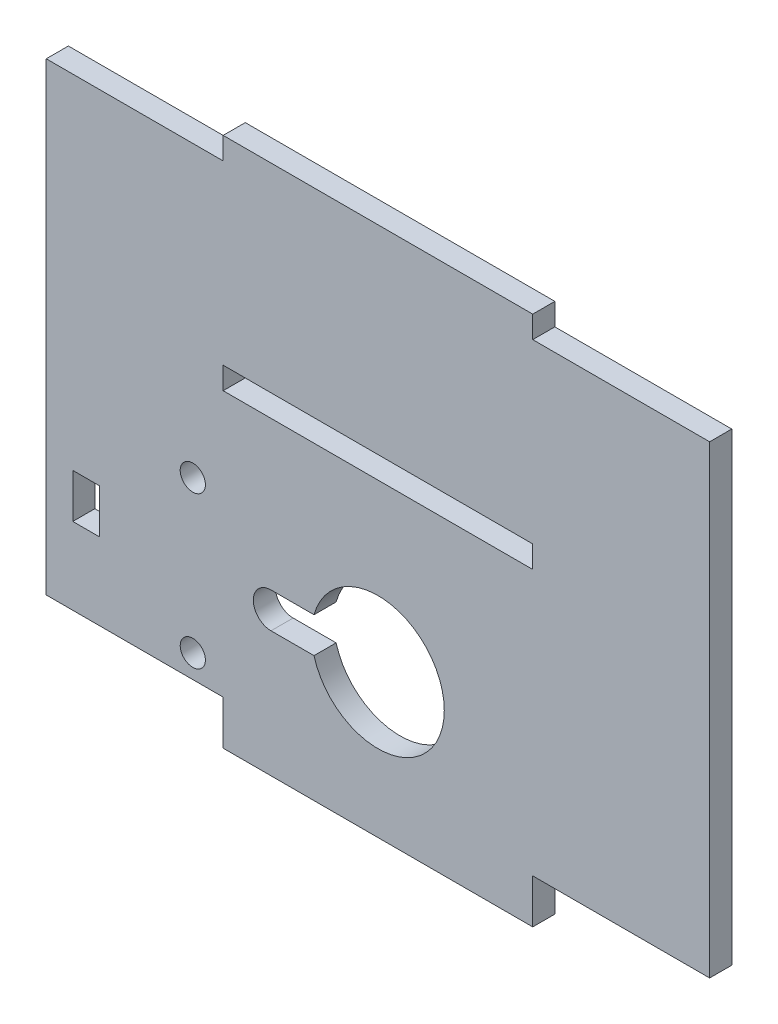
ISO-10303-21;
HEADER;
FILE_DESCRIPTION(('STEP AP214'),'2;1');
FILE_NAME('part.step','',(''),(''),'','','');
FILE_SCHEMA(('AUTOMOTIVE_DESIGN { 1 0 10303 214 1 1 1 1 }'));
ENDSEC;
DATA;
#1=APPLICATION_CONTEXT('core data for automotive mechanical design processes');
#2=APPLICATION_PROTOCOL_DEFINITION('international standard','automotive_design',2000,#1);
#3=PRODUCT_CONTEXT('',#1,'mechanical');
#4=PRODUCT('Part','Part','',(#3));
#5=PRODUCT_RELATED_PRODUCT_CATEGORY('part','',(#4));
#6=PRODUCT_DEFINITION_FORMATION('','',#4);
#7=PRODUCT_DEFINITION_CONTEXT('part definition',#1,'design');
#8=PRODUCT_DEFINITION('design','',#6,#7);
#9=PRODUCT_DEFINITION_SHAPE('','',#8);
#10=(LENGTH_UNIT() NAMED_UNIT(*) SI_UNIT(.MILLI.,.METRE.));
#11=(NAMED_UNIT(*) PLANE_ANGLE_UNIT() SI_UNIT($,.RADIAN.));
#12=(NAMED_UNIT(*) SI_UNIT($,.STERADIAN.) SOLID_ANGLE_UNIT());
#13=UNCERTAINTY_MEASURE_WITH_UNIT(LENGTH_MEASURE(1.E-05),#10,'distance_accuracy_value','');
#14=(GEOMETRIC_REPRESENTATION_CONTEXT(3) GLOBAL_UNCERTAINTY_ASSIGNED_CONTEXT((#13)) GLOBAL_UNIT_ASSIGNED_CONTEXT((#10,
#11,#12)) REPRESENTATION_CONTEXT('',''));
#15=CARTESIAN_POINT('',(0.,0.,0.));
#16=DIRECTION('',(0.,0.,1.));
#17=DIRECTION('',(1.,0.,0.));
#18=AXIS2_PLACEMENT_3D('',#15,#16,#17);
#19=CARTESIAN_POINT('',(0.,0.,2.5));
#20=DIRECTION('',(0.,0.,-1.));
#21=DIRECTION('',(-1.,0.,0.));
#22=AXIS2_PLACEMENT_3D('',#19,#20,#21);
#23=PLANE('',#22);
#24=CARTESIAN_POINT('',(-20.93,-22.38,2.5));
#25=DIRECTION('',(0.,0.,1.));
#26=DIRECTION('',(-1.,0.,0.));
#27=AXIS2_PLACEMENT_3D('',#24,#25,#26);
#28=CIRCLE('',#27,1.425);
#29=CARTESIAN_POINT('',(-22.355,-22.38,2.5));
#30=VERTEX_POINT('',#29);
#31=EDGE_CURVE('E230',#30,#30,#28,.T.);
#32=ORIENTED_EDGE('',*,*,#31,.F.);
#33=EDGE_LOOP('',(#32));
#34=FACE_BOUND('',#33,.T.);
#35=CARTESIAN_POINT('',(-20.93,-5.22000000000001,2.5));
#36=DIRECTION('',(0.,0.,1.));
#37=DIRECTION('',(1.,0.,0.));
#38=AXIS2_PLACEMENT_3D('',#35,#36,#37);
#39=CIRCLE('',#38,1.425);
#40=CARTESIAN_POINT('',(-19.505,-5.22000000000001,2.5));
#41=VERTEX_POINT('',#40);
#42=EDGE_CURVE('E236',#41,#41,#39,.T.);
#43=ORIENTED_EDGE('',*,*,#42,.F.);
#44=EDGE_LOOP('',(#43));
#45=FACE_BOUND('',#44,.T.);
#46=CARTESIAN_POINT('',(0.,-13.8,2.5));
#47=DIRECTION('',(0.,0.,1.));
#48=DIRECTION('',(1.,0.,0.));
#49=AXIS2_PLACEMENT_3D('',#46,#47,#48);
#50=CIRCLE('',#49,7.5);
#51=CARTESIAN_POINT('',(-7.22841614740048,-15.8,2.5));
#52=VERTEX_POINT('',#51);
#53=CARTESIAN_POINT('',(-7.22841614740048,-11.8,2.5));
#54=VERTEX_POINT('',#53);
#55=EDGE_CURVE('E242',#52,#54,#50,.T.);
#56=ORIENTED_EDGE('',*,*,#55,.F.);
#57=DIRECTION('',(1.,0.,0.));
#58=VECTOR('',#57,1.);
#59=CARTESIAN_POINT('',(-12.09,-15.8,2.5));
#60=LINE('',#59,#58);
#61=CARTESIAN_POINT('',(-12.09,-15.8,2.5));
#62=VERTEX_POINT('',#61);
#63=EDGE_CURVE('E250',#62,#52,#60,.T.);
#64=ORIENTED_EDGE('',*,*,#63,.F.);
#65=CARTESIAN_POINT('',(-12.09,-13.8,2.5));
#66=DIRECTION('',(0.,0.,1.));
#67=DIRECTION('',(1.,0.,0.));
#68=AXIS2_PLACEMENT_3D('',#65,#66,#67);
#69=CIRCLE('',#68,2.);
#70=CARTESIAN_POINT('',(-12.09,-11.8,2.5));
#71=VERTEX_POINT('',#70);
#72=EDGE_CURVE('E247',#71,#62,#69,.T.);
#73=ORIENTED_EDGE('',*,*,#72,.F.);
#74=DIRECTION('',(-1.,0.,0.));
#75=VECTOR('',#74,1.);
#76=CARTESIAN_POINT('',(-12.09,-11.8,2.5));
#77=LINE('',#76,#75);
#78=EDGE_CURVE('E244',#54,#71,#77,.T.);
#79=ORIENTED_EDGE('',*,*,#78,.F.);
#80=EDGE_LOOP('',(#56,#64,#73,#79));
#81=FACE_BOUND('',#80,.T.);
#82=DIRECTION('',(0.,-1.,0.));
#83=VECTOR('',#82,1.);
#84=CARTESIAN_POINT('',(-17.5,30.,2.5));
#85=LINE('',#84,#83);
#86=CARTESIAN_POINT('',(-17.5,30.,2.5));
#87=VERTEX_POINT('',#86);
#88=CARTESIAN_POINT('',(-17.5,27.5,2.5));
#89=VERTEX_POINT('',#88);
#90=EDGE_CURVE('E304',#87,#89,#85,.T.);
#91=ORIENTED_EDGE('',*,*,#90,.T.);
#92=DIRECTION('',(-1.,0.,0.));
#93=VECTOR('',#92,1.);
#94=CARTESIAN_POINT('',(-17.5,27.5,2.5));
#95=LINE('',#94,#93);
#96=CARTESIAN_POINT('',(-37.5,27.5,2.5));
#97=VERTEX_POINT('',#96);
#98=EDGE_CURVE('E307',#89,#97,#95,.T.);
#99=ORIENTED_EDGE('',*,*,#98,.T.);
#100=DIRECTION('',(0.,-1.,0.));
#101=VECTOR('',#100,1.);
#102=CARTESIAN_POINT('',(-37.5,27.5,2.5));
#103=LINE('',#102,#101);
#104=CARTESIAN_POINT('',(-37.5,-25.,2.5));
#105=VERTEX_POINT('',#104);
#106=EDGE_CURVE('E310',#97,#105,#103,.T.);
#107=ORIENTED_EDGE('',*,*,#106,.T.);
#108=DIRECTION('',(1.,0.,0.));
#109=VECTOR('',#108,1.);
#110=CARTESIAN_POINT('',(-37.5,-25.,2.5));
#111=LINE('',#110,#109);
#112=CARTESIAN_POINT('',(-17.5,-25.,2.5));
#113=VERTEX_POINT('',#112);
#114=EDGE_CURVE('E312',#105,#113,#111,.T.);
#115=ORIENTED_EDGE('',*,*,#114,.T.);
#116=DIRECTION('',(0.,-1.,0.));
#117=VECTOR('',#116,1.);
#118=CARTESIAN_POINT('',(-17.5,-25.,2.5));
#119=LINE('',#118,#117);
#120=CARTESIAN_POINT('',(-17.5,-30.,2.5));
#121=VERTEX_POINT('',#120);
#122=EDGE_CURVE('E314',#113,#121,#119,.T.);
#123=ORIENTED_EDGE('',*,*,#122,.T.);
#124=DIRECTION('',(1.,0.,0.));
#125=VECTOR('',#124,1.);
#126=CARTESIAN_POINT('',(-17.5,-30.,2.5));
#127=LINE('',#126,#125);
#128=CARTESIAN_POINT('',(17.5,-30.,2.5));
#129=VERTEX_POINT('',#128);
#130=EDGE_CURVE('E316',#121,#129,#127,.T.);
#131=ORIENTED_EDGE('',*,*,#130,.T.);
#132=DIRECTION('',(0.,1.,0.));
#133=VECTOR('',#132,1.);
#134=CARTESIAN_POINT('',(17.5,-25.,2.5));
#135=LINE('',#134,#133);
#136=CARTESIAN_POINT('',(17.5,-25.,2.5));
#137=VERTEX_POINT('',#136);
#138=EDGE_CURVE('E318',#129,#137,#135,.T.);
#139=ORIENTED_EDGE('',*,*,#138,.T.);
#140=DIRECTION('',(1.,0.,0.));
#141=VECTOR('',#140,1.);
#142=CARTESIAN_POINT('',(37.5,-25.,2.5));
#143=LINE('',#142,#141);
#144=CARTESIAN_POINT('',(37.5,-25.,2.5));
#145=VERTEX_POINT('',#144);
#146=EDGE_CURVE('E320',#137,#145,#143,.T.);
#147=ORIENTED_EDGE('',*,*,#146,.T.);
#148=DIRECTION('',(0.,1.,0.));
#149=VECTOR('',#148,1.);
#150=CARTESIAN_POINT('',(37.5,27.5,2.5));
#151=LINE('',#150,#149);
#152=CARTESIAN_POINT('',(37.5,27.5,2.5));
#153=VERTEX_POINT('',#152);
#154=EDGE_CURVE('E322',#145,#153,#151,.T.);
#155=ORIENTED_EDGE('',*,*,#154,.T.);
#156=DIRECTION('',(-1.,0.,0.));
#157=VECTOR('',#156,1.);
#158=CARTESIAN_POINT('',(17.5,27.5,2.5));
#159=LINE('',#158,#157);
#160=CARTESIAN_POINT('',(17.5,27.5,2.5));
#161=VERTEX_POINT('',#160);
#162=EDGE_CURVE('E324',#153,#161,#159,.T.);
#163=ORIENTED_EDGE('',*,*,#162,.T.);
#164=DIRECTION('',(0.,1.,0.));
#165=VECTOR('',#164,1.);
#166=CARTESIAN_POINT('',(17.5,30.,2.5));
#167=LINE('',#166,#165);
#168=CARTESIAN_POINT('',(17.5,30.,2.5));
#169=VERTEX_POINT('',#168);
#170=EDGE_CURVE('E326',#161,#169,#167,.T.);
#171=ORIENTED_EDGE('',*,*,#170,.T.);
#172=DIRECTION('',(-1.,0.,0.));
#173=VECTOR('',#172,1.);
#174=CARTESIAN_POINT('',(17.5,30.,2.5));
#175=LINE('',#174,#173);
#176=EDGE_CURVE('E328',#169,#87,#175,.T.);
#177=ORIENTED_EDGE('',*,*,#176,.T.);
#178=EDGE_LOOP('',(#91,#99,#107,#115,#123,#131,#139,#147,#155,#163,#171,#177));
#179=FACE_BOUND('',#178,.T.);
#180=DIRECTION('',(0.,1.,0.));
#181=VECTOR('',#180,1.);
#182=CARTESIAN_POINT('',(17.5,4.99999999999999,2.5));
#183=LINE('',#182,#181);
#184=CARTESIAN_POINT('',(17.5,4.99999999999999,2.5));
#185=VERTEX_POINT('',#184);
#186=CARTESIAN_POINT('',(17.5,7.49999999999999,2.5));
#187=VERTEX_POINT('',#186);
#188=EDGE_CURVE('E273',#185,#187,#183,.T.);
#189=ORIENTED_EDGE('',*,*,#188,.F.);
#190=DIRECTION('',(1.,0.,0.));
#191=VECTOR('',#190,1.);
#192=CARTESIAN_POINT('',(-17.5,4.99999999999998,2.5));
#193=LINE('',#192,#191);
#194=CARTESIAN_POINT('',(-17.5,4.99999999999998,2.5));
#195=VERTEX_POINT('',#194);
#196=EDGE_CURVE('E281',#195,#185,#193,.T.);
#197=ORIENTED_EDGE('',*,*,#196,.F.);
#198=DIRECTION('',(0.,-1.,0.));
#199=VECTOR('',#198,1.);
#200=CARTESIAN_POINT('',(-17.5,4.99999999999998,2.5));
#201=LINE('',#200,#199);
#202=CARTESIAN_POINT('',(-17.5,7.49999999999999,2.5));
#203=VERTEX_POINT('',#202);
#204=EDGE_CURVE('E278',#203,#195,#201,.T.);
#205=ORIENTED_EDGE('',*,*,#204,.F.);
#206=DIRECTION('',(-1.,0.,0.));
#207=VECTOR('',#206,1.);
#208=CARTESIAN_POINT('',(-17.5,7.49999999999999,2.5));
#209=LINE('',#208,#207);
#210=EDGE_CURVE('E275',#187,#203,#209,.T.);
#211=ORIENTED_EDGE('',*,*,#210,.F.);
#212=EDGE_LOOP('',(#189,#197,#205,#211));
#213=FACE_BOUND('',#212,.T.);
#214=DIRECTION('',(0.,1.,0.));
#215=VECTOR('',#214,1.);
#216=CARTESIAN_POINT('',(-31.5,-16.3,2.5));
#217=LINE('',#216,#215);
#218=CARTESIAN_POINT('',(-31.5,-16.3,2.5));
#219=VERTEX_POINT('',#218);
#220=CARTESIAN_POINT('',(-31.5,-11.3,2.5));
#221=VERTEX_POINT('',#220);
#222=EDGE_CURVE('E194',#219,#221,#217,.T.);
#223=ORIENTED_EDGE('',*,*,#222,.F.);
#224=DIRECTION('',(1.,0.,0.));
#225=VECTOR('',#224,1.);
#226=CARTESIAN_POINT('',(-34.5,-16.3,2.5));
#227=LINE('',#226,#225);
#228=CARTESIAN_POINT('',(-34.5,-16.3,2.5));
#229=VERTEX_POINT('',#228);
#230=EDGE_CURVE('E216',#229,#219,#227,.T.);
#231=ORIENTED_EDGE('',*,*,#230,.F.);
#232=DIRECTION('',(0.,-1.,0.));
#233=VECTOR('',#232,1.);
#234=CARTESIAN_POINT('',(-34.5,-16.3,2.5));
#235=LINE('',#234,#233);
#236=CARTESIAN_POINT('',(-34.5,-11.3,2.5));
#237=VERTEX_POINT('',#236);
#238=EDGE_CURVE('E214',#237,#229,#235,.T.);
#239=ORIENTED_EDGE('',*,*,#238,.F.);
#240=DIRECTION('',(-1.,0.,0.));
#241=VECTOR('',#240,1.);
#242=CARTESIAN_POINT('',(-34.5,-11.3,2.5));
#243=LINE('',#242,#241);
#244=EDGE_CURVE('E202',#221,#237,#243,.T.);
#245=ORIENTED_EDGE('',*,*,#244,.F.);
#246=EDGE_LOOP('',(#223,#231,#239,#245));
#247=FACE_BOUND('',#246,.T.);
#248=ADVANCED_FACE('F33',(#34,#45,#81,#179,#213,#247),#23,.F.);
#249=CARTESIAN_POINT('',(0.,0.,0.));
#250=DIRECTION('',(0.,0.,-1.));
#251=DIRECTION('',(-1.,0.,0.));
#252=AXIS2_PLACEMENT_3D('',#249,#250,#251);
#253=PLANE('',#252);
#254=CARTESIAN_POINT('',(-20.93,-5.22000000000001,0.));
#255=DIRECTION('',(0.,0.,1.));
#256=DIRECTION('',(1.,0.,0.));
#257=AXIS2_PLACEMENT_3D('',#254,#255,#256);
#258=CIRCLE('',#257,1.425);
#259=CARTESIAN_POINT('',(-19.505,-5.22000000000001,0.));
#260=VERTEX_POINT('',#259);
#261=EDGE_CURVE('E233',#260,#260,#258,.T.);
#262=ORIENTED_EDGE('',*,*,#261,.T.);
#263=EDGE_LOOP('',(#262));
#264=FACE_BOUND('',#263,.T.);
#265=DIRECTION('',(0.,-1.,0.));
#266=VECTOR('',#265,1.);
#267=CARTESIAN_POINT('',(-17.5,30.,0.));
#268=LINE('',#267,#266);
#269=CARTESIAN_POINT('',(-17.5,30.,0.));
#270=VERTEX_POINT('',#269);
#271=CARTESIAN_POINT('',(-17.5,27.5,0.));
#272=VERTEX_POINT('',#271);
#273=EDGE_CURVE('E303',#270,#272,#268,.T.);
#274=ORIENTED_EDGE('',*,*,#273,.F.);
#275=DIRECTION('',(-1.,0.,0.));
#276=VECTOR('',#275,1.);
#277=CARTESIAN_POINT('',(17.5,30.,0.));
#278=LINE('',#277,#276);
#279=CARTESIAN_POINT('',(17.5,30.,0.));
#280=VERTEX_POINT('',#279);
#281=EDGE_CURVE('E308',#280,#270,#278,.T.);
#282=ORIENTED_EDGE('',*,*,#281,.F.);
#283=DIRECTION('',(0.,1.,0.));
#284=VECTOR('',#283,1.);
#285=CARTESIAN_POINT('',(17.5,30.,0.));
#286=LINE('',#285,#284);
#287=CARTESIAN_POINT('',(17.5,27.5,0.));
#288=VERTEX_POINT('',#287);
#289=EDGE_CURVE('E351',#288,#280,#286,.T.);
#290=ORIENTED_EDGE('',*,*,#289,.F.);
#291=DIRECTION('',(-1.,0.,0.));
#292=VECTOR('',#291,1.);
#293=CARTESIAN_POINT('',(17.5,27.5,0.));
#294=LINE('',#293,#292);
#295=CARTESIAN_POINT('',(37.5,27.5,0.));
#296=VERTEX_POINT('',#295);
#297=EDGE_CURVE('E349',#296,#288,#294,.T.);
#298=ORIENTED_EDGE('',*,*,#297,.F.);
#299=DIRECTION('',(0.,1.,0.));
#300=VECTOR('',#299,1.);
#301=CARTESIAN_POINT('',(37.5,27.5,0.));
#302=LINE('',#301,#300);
#303=CARTESIAN_POINT('',(37.5,-25.,0.));
#304=VERTEX_POINT('',#303);
#305=EDGE_CURVE('E347',#304,#296,#302,.T.);
#306=ORIENTED_EDGE('',*,*,#305,.F.);
#307=DIRECTION('',(1.,0.,0.));
#308=VECTOR('',#307,1.);
#309=CARTESIAN_POINT('',(37.5,-25.,0.));
#310=LINE('',#309,#308);
#311=CARTESIAN_POINT('',(17.5,-25.,0.));
#312=VERTEX_POINT('',#311);
#313=EDGE_CURVE('E345',#312,#304,#310,.T.);
#314=ORIENTED_EDGE('',*,*,#313,.F.);
#315=DIRECTION('',(0.,1.,0.));
#316=VECTOR('',#315,1.);
#317=CARTESIAN_POINT('',(17.5,-25.,0.));
#318=LINE('',#317,#316);
#319=CARTESIAN_POINT('',(17.5,-30.,0.));
#320=VERTEX_POINT('',#319);
#321=EDGE_CURVE('E343',#320,#312,#318,.T.);
#322=ORIENTED_EDGE('',*,*,#321,.F.);
#323=DIRECTION('',(1.,0.,0.));
#324=VECTOR('',#323,1.);
#325=CARTESIAN_POINT('',(-17.5,-30.,0.));
#326=LINE('',#325,#324);
#327=CARTESIAN_POINT('',(-17.5,-30.,0.));
#328=VERTEX_POINT('',#327);
#329=EDGE_CURVE('E341',#328,#320,#326,.T.);
#330=ORIENTED_EDGE('',*,*,#329,.F.);
#331=DIRECTION('',(0.,-1.,0.));
#332=VECTOR('',#331,1.);
#333=CARTESIAN_POINT('',(-17.5,-25.,0.));
#334=LINE('',#333,#332);
#335=CARTESIAN_POINT('',(-17.5,-25.,0.));
#336=VERTEX_POINT('',#335);
#337=EDGE_CURVE('E339',#336,#328,#334,.T.);
#338=ORIENTED_EDGE('',*,*,#337,.F.);
#339=DIRECTION('',(1.,0.,0.));
#340=VECTOR('',#339,1.);
#341=CARTESIAN_POINT('',(-37.5,-25.,0.));
#342=LINE('',#341,#340);
#343=CARTESIAN_POINT('',(-37.5,-25.,0.));
#344=VERTEX_POINT('',#343);
#345=EDGE_CURVE('E337',#344,#336,#342,.T.);
#346=ORIENTED_EDGE('',*,*,#345,.F.);
#347=DIRECTION('',(0.,-1.,0.));
#348=VECTOR('',#347,1.);
#349=CARTESIAN_POINT('',(-37.5,27.5,0.));
#350=LINE('',#349,#348);
#351=CARTESIAN_POINT('',(-37.5,27.5,0.));
#352=VERTEX_POINT('',#351);
#353=EDGE_CURVE('E335',#352,#344,#350,.T.);
#354=ORIENTED_EDGE('',*,*,#353,.F.);
#355=DIRECTION('',(-1.,0.,0.));
#356=VECTOR('',#355,1.);
#357=CARTESIAN_POINT('',(-17.5,27.5,0.));
#358=LINE('',#357,#356);
#359=EDGE_CURVE('E333',#272,#352,#358,.T.);
#360=ORIENTED_EDGE('',*,*,#359,.F.);
#361=EDGE_LOOP('',(#274,#282,#290,#298,#306,#314,#322,#330,#338,#346,#354,#360));
#362=FACE_BOUND('',#361,.T.);
#363=DIRECTION('',(1.,0.,0.));
#364=VECTOR('',#363,1.);
#365=CARTESIAN_POINT('',(-17.5,4.99999999999998,0.));
#366=LINE('',#365,#364);
#367=CARTESIAN_POINT('',(-17.5,4.99999999999998,0.));
#368=VERTEX_POINT('',#367);
#369=CARTESIAN_POINT('',(17.5,4.99999999999999,0.));
#370=VERTEX_POINT('',#369);
#371=EDGE_CURVE('E276',#368,#370,#366,.T.);
#372=ORIENTED_EDGE('',*,*,#371,.T.);
#373=DIRECTION('',(0.,1.,0.));
#374=VECTOR('',#373,1.);
#375=CARTESIAN_POINT('',(17.5,4.99999999999999,0.));
#376=LINE('',#375,#374);
#377=CARTESIAN_POINT('',(17.5,7.49999999999999,0.));
#378=VERTEX_POINT('',#377);
#379=EDGE_CURVE('E272',#370,#378,#376,.T.);
#380=ORIENTED_EDGE('',*,*,#379,.T.);
#381=DIRECTION('',(-1.,0.,0.));
#382=VECTOR('',#381,1.);
#383=CARTESIAN_POINT('',(-17.5,7.49999999999999,0.));
#384=LINE('',#383,#382);
#385=CARTESIAN_POINT('',(-17.5,7.49999999999999,0.));
#386=VERTEX_POINT('',#385);
#387=EDGE_CURVE('E286',#378,#386,#384,.T.);
#388=ORIENTED_EDGE('',*,*,#387,.T.);
#389=DIRECTION('',(0.,-1.,0.));
#390=VECTOR('',#389,1.);
#391=CARTESIAN_POINT('',(-17.5,4.99999999999998,0.));
#392=LINE('',#391,#390);
#393=EDGE_CURVE('E289',#386,#368,#392,.T.);
#394=ORIENTED_EDGE('',*,*,#393,.T.);
#395=EDGE_LOOP('',(#372,#380,#388,#394));
#396=FACE_BOUND('',#395,.T.);
#397=DIRECTION('',(1.,0.,0.));
#398=VECTOR('',#397,1.);
#399=CARTESIAN_POINT('',(-12.09,-15.8,0.));
#400=LINE('',#399,#398);
#401=CARTESIAN_POINT('',(-12.09,-15.8,0.));
#402=VERTEX_POINT('',#401);
#403=CARTESIAN_POINT('',(-7.22841614740048,-15.8,0.));
#404=VERTEX_POINT('',#403);
#405=EDGE_CURVE('E245',#402,#404,#400,.T.);
#406=ORIENTED_EDGE('',*,*,#405,.T.);
#407=CARTESIAN_POINT('',(0.,-13.8,0.));
#408=DIRECTION('',(0.,0.,1.));
#409=DIRECTION('',(1.,0.,0.));
#410=AXIS2_PLACEMENT_3D('',#407,#408,#409);
#411=CIRCLE('',#410,7.5);
#412=CARTESIAN_POINT('',(-7.22841614740048,-11.8,0.));
#413=VERTEX_POINT('',#412);
#414=EDGE_CURVE('E239',#404,#413,#411,.T.);
#415=ORIENTED_EDGE('',*,*,#414,.T.);
#416=DIRECTION('',(-1.,0.,0.));
#417=VECTOR('',#416,1.);
#418=CARTESIAN_POINT('',(-12.09,-11.8,0.));
#419=LINE('',#418,#417);
#420=CARTESIAN_POINT('',(-12.09,-11.8,0.));
#421=VERTEX_POINT('',#420);
#422=EDGE_CURVE('E255',#413,#421,#419,.T.);
#423=ORIENTED_EDGE('',*,*,#422,.T.);
#424=CARTESIAN_POINT('',(-12.09,-13.8,0.));
#425=DIRECTION('',(0.,0.,1.));
#426=DIRECTION('',(1.,0.,0.));
#427=AXIS2_PLACEMENT_3D('',#424,#425,#426);
#428=CIRCLE('',#427,2.);
#429=EDGE_CURVE('E258',#421,#402,#428,.T.);
#430=ORIENTED_EDGE('',*,*,#429,.T.);
#431=EDGE_LOOP('',(#406,#415,#423,#430));
#432=FACE_BOUND('',#431,.T.);
#433=CARTESIAN_POINT('',(-20.93,-22.38,0.));
#434=DIRECTION('',(0.,0.,1.));
#435=DIRECTION('',(-1.,0.,0.));
#436=AXIS2_PLACEMENT_3D('',#433,#434,#435);
#437=CIRCLE('',#436,1.425);
#438=CARTESIAN_POINT('',(-22.355,-22.38,0.));
#439=VERTEX_POINT('',#438);
#440=EDGE_CURVE('E210',#439,#439,#437,.T.);
#441=ORIENTED_EDGE('',*,*,#440,.T.);
#442=EDGE_LOOP('',(#441));
#443=FACE_BOUND('',#442,.T.);
#444=DIRECTION('',(1.,0.,0.));
#445=VECTOR('',#444,1.);
#446=CARTESIAN_POINT('',(-34.5,-16.3,0.));
#447=LINE('',#446,#445);
#448=CARTESIAN_POINT('',(-34.5,-16.3,0.));
#449=VERTEX_POINT('',#448);
#450=CARTESIAN_POINT('',(-31.5,-16.3,0.));
#451=VERTEX_POINT('',#450);
#452=EDGE_CURVE('E203',#449,#451,#447,.T.);
#453=ORIENTED_EDGE('',*,*,#452,.T.);
#454=DIRECTION('',(0.,1.,0.));
#455=VECTOR('',#454,1.);
#456=CARTESIAN_POINT('',(-31.5,-16.3,0.));
#457=LINE('',#456,#455);
#458=CARTESIAN_POINT('',(-31.5,-11.3,0.));
#459=VERTEX_POINT('',#458);
#460=EDGE_CURVE('E56',#451,#459,#457,.T.);
#461=ORIENTED_EDGE('',*,*,#460,.T.);
#462=DIRECTION('',(-1.,0.,0.));
#463=VECTOR('',#462,1.);
#464=CARTESIAN_POINT('',(-34.5,-11.3,0.));
#465=LINE('',#464,#463);
#466=CARTESIAN_POINT('',(-34.5,-11.3,0.));
#467=VERTEX_POINT('',#466);
#468=EDGE_CURVE('E209',#459,#467,#465,.T.);
#469=ORIENTED_EDGE('',*,*,#468,.T.);
#470=DIRECTION('',(0.,-1.,0.));
#471=VECTOR('',#470,1.);
#472=CARTESIAN_POINT('',(-34.5,-16.3,0.));
#473=LINE('',#472,#471);
#474=EDGE_CURVE('E222',#467,#449,#473,.T.);
#475=ORIENTED_EDGE('',*,*,#474,.T.);
#476=EDGE_LOOP('',(#453,#461,#469,#475));
#477=FACE_BOUND('',#476,.T.);
#478=ADVANCED_FACE('F393',(#264,#362,#396,#432,#443,#477),#253,.T.);
#479=CARTESIAN_POINT('',(-17.5,30.,2.5));
#480=DIRECTION('',(1.,0.,0.));
#481=DIRECTION('',(0.,0.,-1.));
#482=AXIS2_PLACEMENT_3D('',#479,#480,#481);
#483=PLANE('',#482);
#484=ORIENTED_EDGE('',*,*,#273,.T.);
#485=DIRECTION('',(0.,0.,-1.));
#486=VECTOR('',#485,1.);
#487=CARTESIAN_POINT('',(-17.5,27.5,2.5));
#488=LINE('',#487,#486);
#489=EDGE_CURVE('E11',#89,#272,#488,.T.);
#490=ORIENTED_EDGE('',*,*,#489,.F.);
#491=ORIENTED_EDGE('',*,*,#90,.F.);
#492=DIRECTION('',(0.,0.,-1.));
#493=VECTOR('',#492,1.);
#494=CARTESIAN_POINT('',(-17.5,30.,2.5));
#495=LINE('',#494,#493);
#496=EDGE_CURVE('E330',#87,#270,#495,.T.);
#497=ORIENTED_EDGE('',*,*,#496,.T.);
#498=EDGE_LOOP('',(#484,#490,#491,#497));
#499=FACE_BOUND('',#498,.T.);
#500=ADVANCED_FACE('F35',(#499),#483,.F.);
#501=CARTESIAN_POINT('',(-17.5,27.5,2.5));
#502=DIRECTION('',(0.,-1.,0.));
#503=DIRECTION('',(1.,0.,0.));
#504=AXIS2_PLACEMENT_3D('',#501,#502,#503);
#505=PLANE('',#504);
#506=ORIENTED_EDGE('',*,*,#359,.T.);
#507=DIRECTION('',(0.,0.,-1.));
#508=VECTOR('',#507,1.);
#509=CARTESIAN_POINT('',(-37.5,27.5,2.5));
#510=LINE('',#509,#508);
#511=EDGE_CURVE('E41',#97,#352,#510,.T.);
#512=ORIENTED_EDGE('',*,*,#511,.F.);
#513=ORIENTED_EDGE('',*,*,#98,.F.);
#514=ORIENTED_EDGE('',*,*,#489,.T.);
#515=EDGE_LOOP('',(#506,#512,#513,#514));
#516=FACE_BOUND('',#515,.T.);
#517=ADVANCED_FACE('F411',(#516),#505,.F.);
#518=CARTESIAN_POINT('',(-37.5,27.5,2.5));
#519=DIRECTION('',(1.,0.,0.));
#520=DIRECTION('',(0.,0.,-1.));
#521=AXIS2_PLACEMENT_3D('',#518,#519,#520);
#522=PLANE('',#521);
#523=ORIENTED_EDGE('',*,*,#353,.T.);
#524=DIRECTION('',(0.,0.,-1.));
#525=VECTOR('',#524,1.);
#526=CARTESIAN_POINT('',(-37.5,-25.,2.5));
#527=LINE('',#526,#525);
#528=EDGE_CURVE('E380',#105,#344,#527,.T.);
#529=ORIENTED_EDGE('',*,*,#528,.F.);
#530=ORIENTED_EDGE('',*,*,#106,.F.);
#531=ORIENTED_EDGE('',*,*,#511,.T.);
#532=EDGE_LOOP('',(#523,#529,#530,#531));
#533=FACE_BOUND('',#532,.T.);
#534=ADVANCED_FACE('F387',(#533),#522,.F.);
#535=CARTESIAN_POINT('',(-37.5,-25.,2.5));
#536=DIRECTION('',(0.,1.,0.));
#537=DIRECTION('',(0.,0.,1.));
#538=AXIS2_PLACEMENT_3D('',#535,#536,#537);
#539=PLANE('',#538);
#540=ORIENTED_EDGE('',*,*,#345,.T.);
#541=DIRECTION('',(0.,0.,-1.));
#542=VECTOR('',#541,1.);
#543=CARTESIAN_POINT('',(-17.5,-25.,2.5));
#544=LINE('',#543,#542);
#545=EDGE_CURVE('E377',#113,#336,#544,.T.);
#546=ORIENTED_EDGE('',*,*,#545,.F.);
#547=ORIENTED_EDGE('',*,*,#114,.F.);
#548=ORIENTED_EDGE('',*,*,#528,.T.);
#549=EDGE_LOOP('',(#540,#546,#547,#548));
#550=FACE_BOUND('',#549,.T.);
#551=ADVANCED_FACE('F399',(#550),#539,.F.);
#552=CARTESIAN_POINT('',(-17.5,-25.,2.5));
#553=DIRECTION('',(1.,0.,0.));
#554=DIRECTION('',(0.,0.,-1.));
#555=AXIS2_PLACEMENT_3D('',#552,#553,#554);
#556=PLANE('',#555);
#557=ORIENTED_EDGE('',*,*,#337,.T.);
#558=DIRECTION('',(0.,0.,-1.));
#559=VECTOR('',#558,1.);
#560=CARTESIAN_POINT('',(-17.5,-30.,2.5));
#561=LINE('',#560,#559);
#562=EDGE_CURVE('E374',#121,#328,#561,.T.);
#563=ORIENTED_EDGE('',*,*,#562,.F.);
#564=ORIENTED_EDGE('',*,*,#122,.F.);
#565=ORIENTED_EDGE('',*,*,#545,.T.);
#566=EDGE_LOOP('',(#557,#563,#564,#565));
#567=FACE_BOUND('',#566,.T.);
#568=ADVANCED_FACE('F403',(#567),#556,.F.);
#569=CARTESIAN_POINT('',(-17.5,-30.,2.5));
#570=DIRECTION('',(0.,1.,0.));
#571=DIRECTION('',(-1.,0.,0.));
#572=AXIS2_PLACEMENT_3D('',#569,#570,#571);
#573=PLANE('',#572);
#574=ORIENTED_EDGE('',*,*,#329,.T.);
#575=DIRECTION('',(0.,0.,-1.));
#576=VECTOR('',#575,1.);
#577=CARTESIAN_POINT('',(17.5,-30.,2.5));
#578=LINE('',#577,#576);
#579=EDGE_CURVE('E371',#129,#320,#578,.T.);
#580=ORIENTED_EDGE('',*,*,#579,.F.);
#581=ORIENTED_EDGE('',*,*,#130,.F.);
#582=ORIENTED_EDGE('',*,*,#562,.T.);
#583=EDGE_LOOP('',(#574,#580,#581,#582));
#584=FACE_BOUND('',#583,.T.);
#585=ADVANCED_FACE('F444',(#584),#573,.F.);
#586=CARTESIAN_POINT('',(17.5,-25.,2.5));
#587=DIRECTION('',(-1.,0.,0.));
#588=DIRECTION('',(0.,0.,1.));
#589=AXIS2_PLACEMENT_3D('',#586,#587,#588);
#590=PLANE('',#589);
#591=ORIENTED_EDGE('',*,*,#321,.T.);
#592=DIRECTION('',(0.,0.,-1.));
#593=VECTOR('',#592,1.);
#594=CARTESIAN_POINT('',(17.5,-25.,2.5));
#595=LINE('',#594,#593);
#596=EDGE_CURVE('E368',#137,#312,#595,.T.);
#597=ORIENTED_EDGE('',*,*,#596,.F.);
#598=ORIENTED_EDGE('',*,*,#138,.F.);
#599=ORIENTED_EDGE('',*,*,#579,.T.);
#600=EDGE_LOOP('',(#591,#597,#598,#599));
#601=FACE_BOUND('',#600,.T.);
#602=ADVANCED_FACE('F442',(#601),#590,.F.);
#603=CARTESIAN_POINT('',(37.5,-25.,2.5));
#604=DIRECTION('',(0.,1.,0.));
#605=DIRECTION('',(0.,0.,1.));
#606=AXIS2_PLACEMENT_3D('',#603,#604,#605);
#607=PLANE('',#606);
#608=ORIENTED_EDGE('',*,*,#313,.T.);
#609=DIRECTION('',(0.,0.,-1.));
#610=VECTOR('',#609,1.);
#611=CARTESIAN_POINT('',(37.5,-25.,2.5));
#612=LINE('',#611,#610);
#613=EDGE_CURVE('E365',#145,#304,#612,.T.);
#614=ORIENTED_EDGE('',*,*,#613,.F.);
#615=ORIENTED_EDGE('',*,*,#146,.F.);
#616=ORIENTED_EDGE('',*,*,#596,.T.);
#617=EDGE_LOOP('',(#608,#614,#615,#616));
#618=FACE_BOUND('',#617,.T.);
#619=ADVANCED_FACE('F438',(#618),#607,.F.);
#620=CARTESIAN_POINT('',(37.5,27.5,2.5));
#621=DIRECTION('',(-1.,0.,0.));
#622=DIRECTION('',(0.,0.,1.));
#623=AXIS2_PLACEMENT_3D('',#620,#621,#622);
#624=PLANE('',#623);
#625=ORIENTED_EDGE('',*,*,#305,.T.);
#626=DIRECTION('',(0.,0.,-1.));
#627=VECTOR('',#626,1.);
#628=CARTESIAN_POINT('',(37.5,27.5,2.5));
#629=LINE('',#628,#627);
#630=EDGE_CURVE('E362',#153,#296,#629,.T.);
#631=ORIENTED_EDGE('',*,*,#630,.F.);
#632=ORIENTED_EDGE('',*,*,#154,.F.);
#633=ORIENTED_EDGE('',*,*,#613,.T.);
#634=EDGE_LOOP('',(#625,#631,#632,#633));
#635=FACE_BOUND('',#634,.T.);
#636=ADVANCED_FACE('F433',(#635),#624,.F.);
#637=CARTESIAN_POINT('',(17.5,27.5,2.5));
#638=DIRECTION('',(0.,-1.,0.));
#639=DIRECTION('',(1.,0.,0.));
#640=AXIS2_PLACEMENT_3D('',#637,#638,#639);
#641=PLANE('',#640);
#642=ORIENTED_EDGE('',*,*,#297,.T.);
#643=DIRECTION('',(0.,0.,-1.));
#644=VECTOR('',#643,1.);
#645=CARTESIAN_POINT('',(17.5,27.5,2.5));
#646=LINE('',#645,#644);
#647=EDGE_CURVE('E359',#161,#288,#646,.T.);
#648=ORIENTED_EDGE('',*,*,#647,.F.);
#649=ORIENTED_EDGE('',*,*,#162,.F.);
#650=ORIENTED_EDGE('',*,*,#630,.T.);
#651=EDGE_LOOP('',(#642,#648,#649,#650));
#652=FACE_BOUND('',#651,.T.);
#653=ADVANCED_FACE('F427',(#652),#641,.F.);
#654=CARTESIAN_POINT('',(17.5,30.,2.5));
#655=DIRECTION('',(-1.,0.,0.));
#656=DIRECTION('',(0.,0.,1.));
#657=AXIS2_PLACEMENT_3D('',#654,#655,#656);
#658=PLANE('',#657);
#659=ORIENTED_EDGE('',*,*,#289,.T.);
#660=DIRECTION('',(0.,0.,-1.));
#661=VECTOR('',#660,1.);
#662=CARTESIAN_POINT('',(17.5,30.,2.5));
#663=LINE('',#662,#661);
#664=EDGE_CURVE('E356',#169,#280,#663,.T.);
#665=ORIENTED_EDGE('',*,*,#664,.F.);
#666=ORIENTED_EDGE('',*,*,#170,.F.);
#667=ORIENTED_EDGE('',*,*,#647,.T.);
#668=EDGE_LOOP('',(#659,#665,#666,#667));
#669=FACE_BOUND('',#668,.T.);
#670=ADVANCED_FACE('F423',(#669),#658,.F.);
#671=CARTESIAN_POINT('',(17.5,30.,2.5));
#672=DIRECTION('',(0.,-1.,0.));
#673=DIRECTION('',(1.,0.,0.));
#674=AXIS2_PLACEMENT_3D('',#671,#672,#673);
#675=PLANE('',#674);
#676=ORIENTED_EDGE('',*,*,#281,.T.);
#677=ORIENTED_EDGE('',*,*,#496,.F.);
#678=ORIENTED_EDGE('',*,*,#176,.F.);
#679=ORIENTED_EDGE('',*,*,#664,.T.);
#680=EDGE_LOOP('',(#676,#677,#678,#679));
#681=FACE_BOUND('',#680,.T.);
#682=ADVANCED_FACE('F418',(#681),#675,.F.);
#683=CARTESIAN_POINT('',(17.5,4.99999999999999,2.5));
#684=DIRECTION('',(-1.,0.,0.));
#685=DIRECTION('',(0.,0.,1.));
#686=AXIS2_PLACEMENT_3D('',#683,#684,#685);
#687=PLANE('',#686);
#688=ORIENTED_EDGE('',*,*,#379,.F.);
#689=DIRECTION('',(0.,0.,-1.));
#690=VECTOR('',#689,1.);
#691=CARTESIAN_POINT('',(17.5,4.99999999999999,2.5));
#692=LINE('',#691,#690);
#693=EDGE_CURVE('E283',#185,#370,#692,.T.);
#694=ORIENTED_EDGE('',*,*,#693,.F.);
#695=ORIENTED_EDGE('',*,*,#188,.T.);
#696=DIRECTION('',(0.,0.,-1.));
#697=VECTOR('',#696,1.);
#698=CARTESIAN_POINT('',(17.5,7.49999999999999,2.5));
#699=LINE('',#698,#697);
#700=EDGE_CURVE('E300',#187,#378,#699,.T.);
#701=ORIENTED_EDGE('',*,*,#700,.T.);
#702=EDGE_LOOP('',(#688,#694,#695,#701));
#703=FACE_BOUND('',#702,.T.);
#704=ADVANCED_FACE('F464',(#703),#687,.T.);
#705=CARTESIAN_POINT('',(-17.5,7.49999999999999,2.5));
#706=DIRECTION('',(0.,-1.,0.));
#707=DIRECTION('',(1.,0.,0.));
#708=AXIS2_PLACEMENT_3D('',#705,#706,#707);
#709=PLANE('',#708);
#710=ORIENTED_EDGE('',*,*,#387,.F.);
#711=ORIENTED_EDGE('',*,*,#700,.F.);
#712=ORIENTED_EDGE('',*,*,#210,.T.);
#713=DIRECTION('',(0.,0.,-1.));
#714=VECTOR('',#713,1.);
#715=CARTESIAN_POINT('',(-17.5,7.49999999999999,2.5));
#716=LINE('',#715,#714);
#717=EDGE_CURVE('E298',#203,#386,#716,.T.);
#718=ORIENTED_EDGE('',*,*,#717,.T.);
#719=EDGE_LOOP('',(#710,#711,#712,#718));
#720=FACE_BOUND('',#719,.T.);
#721=ADVANCED_FACE('F502',(#720),#709,.T.);
#722=CARTESIAN_POINT('',(-17.5,4.99999999999998,2.5));
#723=DIRECTION('',(1.,0.,0.));
#724=DIRECTION('',(0.,0.,-1.));
#725=AXIS2_PLACEMENT_3D('',#722,#723,#724);
#726=PLANE('',#725);
#727=ORIENTED_EDGE('',*,*,#393,.F.);
#728=ORIENTED_EDGE('',*,*,#717,.F.);
#729=ORIENTED_EDGE('',*,*,#204,.T.);
#730=DIRECTION('',(0.,0.,-1.));
#731=VECTOR('',#730,1.);
#732=CARTESIAN_POINT('',(-17.5,4.99999999999998,2.5));
#733=LINE('',#732,#731);
#734=EDGE_CURVE('E296',#195,#368,#733,.T.);
#735=ORIENTED_EDGE('',*,*,#734,.T.);
#736=EDGE_LOOP('',(#727,#728,#729,#735));
#737=FACE_BOUND('',#736,.T.);
#738=ADVANCED_FACE('F509',(#737),#726,.T.);
#739=CARTESIAN_POINT('',(-17.5,4.99999999999998,2.5));
#740=DIRECTION('',(0.,1.,0.));
#741=DIRECTION('',(-1.,0.,0.));
#742=AXIS2_PLACEMENT_3D('',#739,#740,#741);
#743=PLANE('',#742);
#744=ORIENTED_EDGE('',*,*,#371,.F.);
#745=ORIENTED_EDGE('',*,*,#734,.F.);
#746=ORIENTED_EDGE('',*,*,#196,.T.);
#747=ORIENTED_EDGE('',*,*,#693,.T.);
#748=EDGE_LOOP('',(#744,#745,#746,#747));
#749=FACE_BOUND('',#748,.T.);
#750=ADVANCED_FACE('F516',(#749),#743,.T.);
#751=CARTESIAN_POINT('',(0.,-13.8,2.5));
#752=DIRECTION('',(0.,0.,-1.));
#753=DIRECTION('',(-1.,0.,0.));
#754=AXIS2_PLACEMENT_3D('',#751,#752,#753);
#755=CYLINDRICAL_SURFACE('',#754,7.5);
#756=ORIENTED_EDGE('',*,*,#414,.F.);
#757=DIRECTION('',(0.,0.,-1.));
#758=VECTOR('',#757,1.);
#759=CARTESIAN_POINT('',(-7.22841614740048,-15.8,2.5));
#760=LINE('',#759,#758);
#761=EDGE_CURVE('E252',#52,#404,#760,.T.);
#762=ORIENTED_EDGE('',*,*,#761,.F.);
#763=ORIENTED_EDGE('',*,*,#55,.T.);
#764=DIRECTION('',(0.,0.,-1.));
#765=VECTOR('',#764,1.);
#766=CARTESIAN_POINT('',(-7.22841614740048,-11.8,2.5));
#767=LINE('',#766,#765);
#768=EDGE_CURVE('E269',#54,#413,#767,.T.);
#769=ORIENTED_EDGE('',*,*,#768,.T.);
#770=EDGE_LOOP('',(#756,#762,#763,#769));
#771=FACE_BOUND('',#770,.T.);
#772=ADVANCED_FACE('F524',(#771),#755,.F.);
#773=CARTESIAN_POINT('',(-12.09,-11.8,2.5));
#774=DIRECTION('',(0.,-1.,0.));
#775=DIRECTION('',(1.,0.,0.));
#776=AXIS2_PLACEMENT_3D('',#773,#774,#775);
#777=PLANE('',#776);
#778=ORIENTED_EDGE('',*,*,#422,.F.);
#779=ORIENTED_EDGE('',*,*,#768,.F.);
#780=ORIENTED_EDGE('',*,*,#78,.T.);
#781=DIRECTION('',(0.,0.,-1.));
#782=VECTOR('',#781,1.);
#783=CARTESIAN_POINT('',(-12.09,-11.8,2.5));
#784=LINE('',#783,#782);
#785=EDGE_CURVE('E267',#71,#421,#784,.T.);
#786=ORIENTED_EDGE('',*,*,#785,.T.);
#787=EDGE_LOOP('',(#778,#779,#780,#786));
#788=FACE_BOUND('',#787,.T.);
#789=ADVANCED_FACE('F532',(#788),#777,.T.);
#790=CARTESIAN_POINT('',(-12.09,-13.8,2.5));
#791=DIRECTION('',(0.,0.,-1.));
#792=DIRECTION('',(-1.,0.,0.));
#793=AXIS2_PLACEMENT_3D('',#790,#791,#792);
#794=CYLINDRICAL_SURFACE('',#793,2.);
#795=ORIENTED_EDGE('',*,*,#429,.F.);
#796=ORIENTED_EDGE('',*,*,#785,.F.);
#797=ORIENTED_EDGE('',*,*,#72,.T.);
#798=DIRECTION('',(0.,0.,-1.));
#799=VECTOR('',#798,1.);
#800=CARTESIAN_POINT('',(-12.09,-15.8,2.5));
#801=LINE('',#800,#799);
#802=EDGE_CURVE('E265',#62,#402,#801,.T.);
#803=ORIENTED_EDGE('',*,*,#802,.T.);
#804=EDGE_LOOP('',(#795,#796,#797,#803));
#805=FACE_BOUND('',#804,.T.);
#806=ADVANCED_FACE('F540',(#805),#794,.F.);
#807=CARTESIAN_POINT('',(-12.09,-15.8,2.5));
#808=DIRECTION('',(0.,1.,0.));
#809=DIRECTION('',(0.,0.,1.));
#810=AXIS2_PLACEMENT_3D('',#807,#808,#809);
#811=PLANE('',#810);
#812=ORIENTED_EDGE('',*,*,#405,.F.);
#813=ORIENTED_EDGE('',*,*,#802,.F.);
#814=ORIENTED_EDGE('',*,*,#63,.T.);
#815=ORIENTED_EDGE('',*,*,#761,.T.);
#816=EDGE_LOOP('',(#812,#813,#814,#815));
#817=FACE_BOUND('',#816,.T.);
#818=ADVANCED_FACE('F548',(#817),#811,.T.);
#819=CARTESIAN_POINT('',(-20.93,-5.22000000000001,2.5));
#820=DIRECTION('',(0.,0.,-1.));
#821=DIRECTION('',(-1.,0.,0.));
#822=AXIS2_PLACEMENT_3D('',#819,#820,#821);
#823=CYLINDRICAL_SURFACE('',#822,1.425);
#824=ORIENTED_EDGE('',*,*,#42,.T.);
#825=EDGE_LOOP('',(#824));
#826=FACE_BOUND('',#825,.T.);
#827=ORIENTED_EDGE('',*,*,#261,.F.);
#828=EDGE_LOOP('',(#827));
#829=FACE_BOUND('',#828,.T.);
#830=ADVANCED_FACE('F556',(#826,#829),#823,.F.);
#831=CARTESIAN_POINT('',(-20.93,-22.38,2.5));
#832=DIRECTION('',(0.,0.,-1.));
#833=DIRECTION('',(-1.,0.,0.));
#834=AXIS2_PLACEMENT_3D('',#831,#832,#833);
#835=CYLINDRICAL_SURFACE('',#834,1.425);
#836=ORIENTED_EDGE('',*,*,#31,.T.);
#837=EDGE_LOOP('',(#836));
#838=FACE_BOUND('',#837,.T.);
#839=ORIENTED_EDGE('',*,*,#440,.F.);
#840=EDGE_LOOP('',(#839));
#841=FACE_BOUND('',#840,.T.);
#842=ADVANCED_FACE('F564',(#838,#841),#835,.F.);
#843=CARTESIAN_POINT('',(-31.5,-16.3,2.5));
#844=DIRECTION('',(-1.,0.,0.));
#845=DIRECTION('',(0.,0.,1.));
#846=AXIS2_PLACEMENT_3D('',#843,#844,#845);
#847=PLANE('',#846);
#848=ORIENTED_EDGE('',*,*,#460,.F.);
#849=DIRECTION('',(0.,0.,-1.));
#850=VECTOR('',#849,1.);
#851=CARTESIAN_POINT('',(-31.5,-16.3,2.5));
#852=LINE('',#851,#850);
#853=EDGE_CURVE('E198',#219,#451,#852,.T.);
#854=ORIENTED_EDGE('',*,*,#853,.F.);
#855=ORIENTED_EDGE('',*,*,#222,.T.);
#856=DIRECTION('',(0.,0.,-1.));
#857=VECTOR('',#856,1.);
#858=CARTESIAN_POINT('',(-31.5,-11.3,2.5));
#859=LINE('',#858,#857);
#860=EDGE_CURVE('E197',#221,#459,#859,.T.);
#861=ORIENTED_EDGE('',*,*,#860,.T.);
#862=EDGE_LOOP('',(#848,#854,#855,#861));
#863=FACE_BOUND('',#862,.T.);
#864=ADVANCED_FACE('F196',(#863),#847,.T.);
#865=CARTESIAN_POINT('',(-34.5,-11.3,2.5));
#866=DIRECTION('',(0.,-1.,0.));
#867=DIRECTION('',(0.,0.,-1.));
#868=AXIS2_PLACEMENT_3D('',#865,#866,#867);
#869=PLANE('',#868);
#870=ORIENTED_EDGE('',*,*,#468,.F.);
#871=ORIENTED_EDGE('',*,*,#860,.F.);
#872=ORIENTED_EDGE('',*,*,#244,.T.);
#873=DIRECTION('',(0.,0.,-1.));
#874=VECTOR('',#873,1.);
#875=CARTESIAN_POINT('',(-34.5,-11.3,2.5));
#876=LINE('',#875,#874);
#877=EDGE_CURVE('E211',#237,#467,#876,.T.);
#878=ORIENTED_EDGE('',*,*,#877,.T.);
#879=EDGE_LOOP('',(#870,#871,#872,#878));
#880=FACE_BOUND('',#879,.T.);
#881=ADVANCED_FACE('F206',(#880),#869,.T.);
#882=CARTESIAN_POINT('',(-34.5,-16.3,2.5));
#883=DIRECTION('',(1.,0.,0.));
#884=DIRECTION('',(0.,0.,-1.));
#885=AXIS2_PLACEMENT_3D('',#882,#883,#884);
#886=PLANE('',#885);
#887=ORIENTED_EDGE('',*,*,#474,.F.);
#888=ORIENTED_EDGE('',*,*,#877,.F.);
#889=ORIENTED_EDGE('',*,*,#238,.T.);
#890=DIRECTION('',(0.,0.,-1.));
#891=VECTOR('',#890,1.);
#892=CARTESIAN_POINT('',(-34.5,-16.3,2.5));
#893=LINE('',#892,#891);
#894=EDGE_CURVE('E48',#229,#449,#893,.T.);
#895=ORIENTED_EDGE('',*,*,#894,.T.);
#896=EDGE_LOOP('',(#887,#888,#889,#895));
#897=FACE_BOUND('',#896,.T.);
#898=ADVANCED_FACE('F585',(#897),#886,.T.);
#899=CARTESIAN_POINT('',(-34.5,-16.3,2.5));
#900=DIRECTION('',(0.,1.,0.));
#901=DIRECTION('',(0.,0.,1.));
#902=AXIS2_PLACEMENT_3D('',#899,#900,#901);
#903=PLANE('',#902);
#904=ORIENTED_EDGE('',*,*,#452,.F.);
#905=ORIENTED_EDGE('',*,*,#894,.F.);
#906=ORIENTED_EDGE('',*,*,#230,.T.);
#907=ORIENTED_EDGE('',*,*,#853,.T.);
#908=EDGE_LOOP('',(#904,#905,#906,#907));
#909=FACE_BOUND('',#908,.T.);
#910=ADVANCED_FACE('F592',(#909),#903,.T.);
#911=CLOSED_SHELL('',(#248,#478,#500,#517,#534,#551,#568,#585,#602,#619,#636,#653,#670,#682,
#704,#721,#738,#750,#772,#789,#806,#818,#830,#842,#864,#881,#898,#910));
#912=MANIFOLD_SOLID_BREP('B2',#911);
#913=ADVANCED_BREP_SHAPE_REPRESENTATION('',(#18,#912),#14);
#914=SHAPE_DEFINITION_REPRESENTATION(#9,#913);
ENDSEC;
END-ISO-10303-21;
